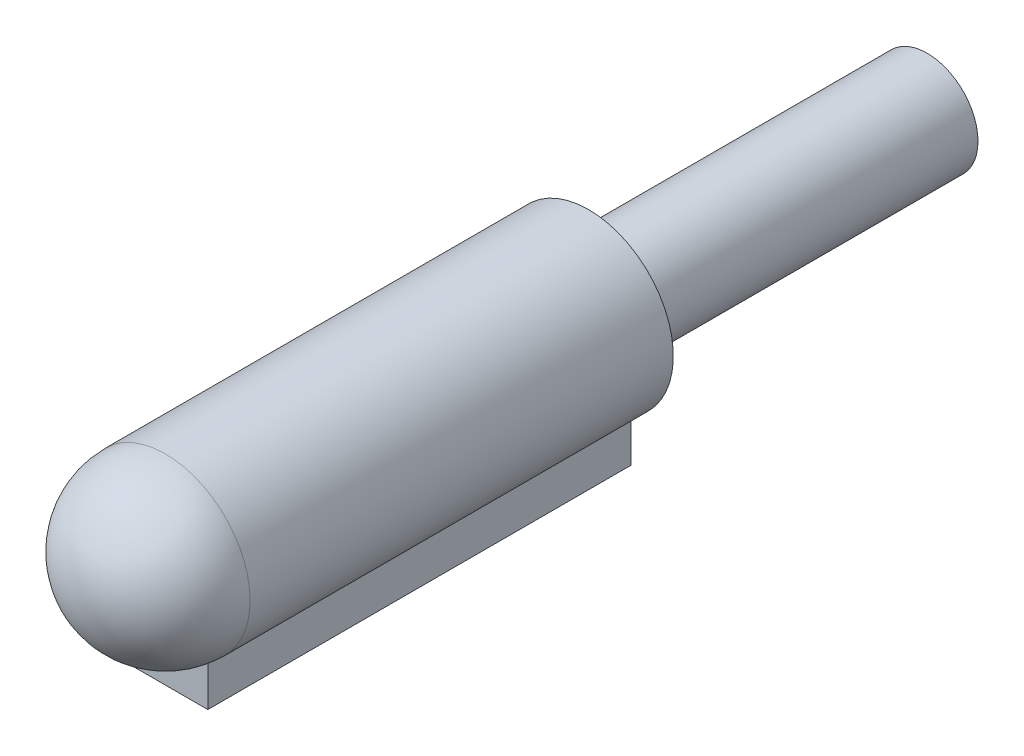
ISO-10303-21;
HEADER;
FILE_DESCRIPTION(('STEP AP214'),'2;1');
FILE_NAME('part.step','',(''),(''),'','','');
FILE_SCHEMA(('AUTOMOTIVE_DESIGN { 1 0 10303 214 1 1 1 1 }'));
ENDSEC;
DATA;
#1=APPLICATION_CONTEXT('core data for automotive mechanical design processes');
#2=APPLICATION_PROTOCOL_DEFINITION('international standard','automotive_design',2000,#1);
#3=PRODUCT_CONTEXT('',#1,'mechanical');
#4=PRODUCT('Part','Part','',(#3));
#5=PRODUCT_RELATED_PRODUCT_CATEGORY('part','',(#4));
#6=PRODUCT_DEFINITION_FORMATION('','',#4);
#7=PRODUCT_DEFINITION_CONTEXT('part definition',#1,'design');
#8=PRODUCT_DEFINITION('design','',#6,#7);
#9=PRODUCT_DEFINITION_SHAPE('','',#8);
#10=(LENGTH_UNIT() NAMED_UNIT(*) SI_UNIT(.MILLI.,.METRE.));
#11=(NAMED_UNIT(*) PLANE_ANGLE_UNIT() SI_UNIT($,.RADIAN.));
#12=(NAMED_UNIT(*) SI_UNIT($,.STERADIAN.) SOLID_ANGLE_UNIT());
#13=UNCERTAINTY_MEASURE_WITH_UNIT(LENGTH_MEASURE(1.E-05),#10,'distance_accuracy_value','');
#14=(GEOMETRIC_REPRESENTATION_CONTEXT(3) GLOBAL_UNCERTAINTY_ASSIGNED_CONTEXT((#13)) GLOBAL_UNIT_ASSIGNED_CONTEXT((#10,
#11,#12)) REPRESENTATION_CONTEXT('',''));
#15=CARTESIAN_POINT('',(0.,0.,0.));
#16=DIRECTION('',(0.,0.,1.));
#17=DIRECTION('',(1.,0.,0.));
#18=AXIS2_PLACEMENT_3D('',#15,#16,#17);
#19=CARTESIAN_POINT('',(0.,0.,30.));
#20=DIRECTION('',(0.,0.,-1.));
#21=DIRECTION('',(-1.,0.,0.));
#22=AXIS2_PLACEMENT_3D('',#19,#20,#21);
#23=CYLINDRICAL_SURFACE('',#22,5.);
#24=DIRECTION('',(0.,0.,-1.));
#25=VECTOR('',#24,1.);
#26=CARTESIAN_POINT('',(2.5,-4.33012701892219,25.));
#27=LINE('',#26,#25);
#28=CARTESIAN_POINT('',(2.5,-4.33012701892219,25.));
#29=VERTEX_POINT('',#28);
#30=CARTESIAN_POINT('',(2.5,-4.33012701892219,0.));
#31=VERTEX_POINT('',#30);
#32=EDGE_CURVE('E59',#29,#31,#27,.T.);
#33=ORIENTED_EDGE('',*,*,#32,.T.);
#34=CARTESIAN_POINT('',(0.,0.,0.));
#35=DIRECTION('',(0.,0.,1.));
#36=DIRECTION('',(1.,0.,0.));
#37=AXIS2_PLACEMENT_3D('',#34,#35,#36);
#38=CIRCLE('',#37,5.);
#39=CARTESIAN_POINT('',(-2.5,-4.33012701892219,0.));
#40=VERTEX_POINT('',#39);
#41=EDGE_CURVE('E63',#31,#40,#38,.T.);
#42=ORIENTED_EDGE('',*,*,#41,.T.);
#43=DIRECTION('',(0.,0.,-1.));
#44=VECTOR('',#43,1.);
#45=CARTESIAN_POINT('',(-2.5,-4.33012701892219,25.));
#46=LINE('',#45,#44);
#47=CARTESIAN_POINT('',(-2.5,-4.33012701892219,25.));
#48=VERTEX_POINT('',#47);
#49=EDGE_CURVE('E116',#48,#40,#46,.T.);
#50=ORIENTED_EDGE('',*,*,#49,.F.);
#51=CARTESIAN_POINT('',(0.,0.,25.));
#52=DIRECTION('',(0.,0.,-1.));
#53=DIRECTION('',(-1.,0.,0.));
#54=AXIS2_PLACEMENT_3D('',#51,#52,#53);
#55=CIRCLE('',#54,5.);
#56=EDGE_CURVE('E52',#48,#29,#55,.T.);
#57=ORIENTED_EDGE('',*,*,#56,.T.);
#58=EDGE_LOOP('',(#33,#42,#50,#57));
#59=FACE_BOUND('',#58,.T.);
#60=ADVANCED_FACE('F44',(#59),#23,.T.);
#61=CARTESIAN_POINT('',(0.,0.,0.));
#62=DIRECTION('',(0.,0.,1.));
#63=DIRECTION('',(1.,0.,0.));
#64=AXIS2_PLACEMENT_3D('',#61,#62,#63);
#65=PLANE('',#64);
#66=CARTESIAN_POINT('',(0.,0.,0.));
#67=DIRECTION('',(0.,0.,1.));
#68=DIRECTION('',(1.,0.,0.));
#69=AXIS2_PLACEMENT_3D('',#66,#67,#68);
#70=CIRCLE('',#69,3.);
#71=CARTESIAN_POINT('',(3.,0.,0.));
#72=VERTEX_POINT('',#71);
#73=EDGE_CURVE('E115',#72,#72,#70,.T.);
#74=ORIENTED_EDGE('',*,*,#73,.T.);
#75=EDGE_LOOP('',(#74));
#76=FACE_BOUND('',#75,.T.);
#77=ORIENTED_EDGE('',*,*,#41,.F.);
#78=DIRECTION('',(0.,1.,0.));
#79=VECTOR('',#78,1.);
#80=CARTESIAN_POINT('',(2.5,0.,0.));
#81=LINE('',#80,#79);
#82=CARTESIAN_POINT('',(2.5,-6.83012701892219,0.));
#83=VERTEX_POINT('',#82);
#84=EDGE_CURVE('E111',#83,#31,#81,.T.);
#85=ORIENTED_EDGE('',*,*,#84,.F.);
#86=DIRECTION('',(1.,0.,0.));
#87=VECTOR('',#86,1.);
#88=CARTESIAN_POINT('',(0.,-6.83012701892219,0.));
#89=LINE('',#88,#87);
#90=CARTESIAN_POINT('',(-2.5,-6.83012701892219,0.));
#91=VERTEX_POINT('',#90);
#92=EDGE_CURVE('E99',#91,#83,#89,.T.);
#93=ORIENTED_EDGE('',*,*,#92,.F.);
#94=DIRECTION('',(0.,-1.,0.));
#95=VECTOR('',#94,1.);
#96=CARTESIAN_POINT('',(-2.5,0.,0.));
#97=LINE('',#96,#95);
#98=EDGE_CURVE('E106',#40,#91,#97,.T.);
#99=ORIENTED_EDGE('',*,*,#98,.F.);
#100=EDGE_LOOP('',(#77,#85,#93,#99));
#101=FACE_BOUND('',#100,.T.);
#102=ADVANCED_FACE('F129',(#76,#101),#65,.F.);
#103=CARTESIAN_POINT('',(0.,0.,-20.));
#104=DIRECTION('',(0.,0.,1.));
#105=DIRECTION('',(1.,0.,0.));
#106=AXIS2_PLACEMENT_3D('',#103,#104,#105);
#107=CYLINDRICAL_SURFACE('',#106,3.);
#108=CARTESIAN_POINT('',(0.,0.,-20.));
#109=DIRECTION('',(0.,0.,1.));
#110=DIRECTION('',(1.,0.,0.));
#111=AXIS2_PLACEMENT_3D('',#108,#109,#110);
#112=CIRCLE('',#111,3.);
#113=CARTESIAN_POINT('',(3.,0.,-20.));
#114=VERTEX_POINT('',#113);
#115=EDGE_CURVE('E119',#114,#114,#112,.T.);
#116=ORIENTED_EDGE('',*,*,#115,.T.);
#117=EDGE_LOOP('',(#116));
#118=FACE_BOUND('',#117,.T.);
#119=ORIENTED_EDGE('',*,*,#73,.F.);
#120=EDGE_LOOP('',(#119));
#121=FACE_BOUND('',#120,.T.);
#122=ADVANCED_FACE('F131',(#118,#121),#107,.T.);
#123=CARTESIAN_POINT('',(0.,0.,-20.));
#124=DIRECTION('',(0.,0.,1.));
#125=DIRECTION('',(1.,0.,0.));
#126=AXIS2_PLACEMENT_3D('',#123,#124,#125);
#127=PLANE('',#126);
#128=ORIENTED_EDGE('',*,*,#115,.F.);
#129=EDGE_LOOP('',(#128));
#130=FACE_BOUND('',#129,.T.);
#131=ADVANCED_FACE('F138',(#130),#127,.F.);
#132=CARTESIAN_POINT('',(0.,0.,25.));
#133=DIRECTION('',(0.,0.,1.));
#134=DIRECTION('',(1.,0.,0.));
#135=AXIS2_PLACEMENT_3D('',#132,#133,#134);
#136=SPHERICAL_SURFACE('',#135,5.);
#137=EDGE_CURVE('E13',#29,#48,#55,.T.);
#138=ORIENTED_EDGE('',*,*,#137,.F.);
#139=ORIENTED_EDGE('',*,*,#56,.F.);
#140=EDGE_LOOP('',(#138,#139));
#141=FACE_BOUND('',#140,.T.);
#142=ADVANCED_FACE('F46',(#141),#136,.T.);
#143=CARTESIAN_POINT('',(2.5,0.,25.));
#144=DIRECTION('',(-1.,0.,0.));
#145=DIRECTION('',(0.,0.,1.));
#146=AXIS2_PLACEMENT_3D('',#143,#144,#145);
#147=PLANE('',#146);
#148=ORIENTED_EDGE('',*,*,#84,.T.);
#149=ORIENTED_EDGE('',*,*,#32,.F.);
#150=DIRECTION('',(0.,1.,0.));
#151=VECTOR('',#150,1.);
#152=CARTESIAN_POINT('',(2.5,0.,25.));
#153=LINE('',#152,#151);
#154=CARTESIAN_POINT('',(2.5,-6.83012701892219,25.));
#155=VERTEX_POINT('',#154);
#156=EDGE_CURVE('E88',#155,#29,#153,.T.);
#157=ORIENTED_EDGE('',*,*,#156,.F.);
#158=DIRECTION('',(0.,0.,-1.));
#159=VECTOR('',#158,1.);
#160=CARTESIAN_POINT('',(2.5,-6.83012701892219,25.));
#161=LINE('',#160,#159);
#162=EDGE_CURVE('E96',#155,#83,#161,.T.);
#163=ORIENTED_EDGE('',*,*,#162,.T.);
#164=EDGE_LOOP('',(#148,#149,#157,#163));
#165=FACE_BOUND('',#164,.T.);
#166=ADVANCED_FACE('F105',(#165),#147,.F.);
#167=CARTESIAN_POINT('',(-2.5,0.,25.));
#168=DIRECTION('',(1.,0.,0.));
#169=DIRECTION('',(0.,0.,-1.));
#170=AXIS2_PLACEMENT_3D('',#167,#168,#169);
#171=PLANE('',#170);
#172=ORIENTED_EDGE('',*,*,#98,.T.);
#173=DIRECTION('',(0.,0.,-1.));
#174=VECTOR('',#173,1.);
#175=CARTESIAN_POINT('',(-2.5,-6.83012701892219,25.));
#176=LINE('',#175,#174);
#177=CARTESIAN_POINT('',(-2.5,-6.83012701892219,25.));
#178=VERTEX_POINT('',#177);
#179=EDGE_CURVE('E103',#178,#91,#176,.T.);
#180=ORIENTED_EDGE('',*,*,#179,.F.);
#181=DIRECTION('',(0.,-1.,0.));
#182=VECTOR('',#181,1.);
#183=CARTESIAN_POINT('',(-2.5,0.,25.));
#184=LINE('',#183,#182);
#185=EDGE_CURVE('E90',#48,#178,#184,.T.);
#186=ORIENTED_EDGE('',*,*,#185,.F.);
#187=ORIENTED_EDGE('',*,*,#49,.T.);
#188=EDGE_LOOP('',(#172,#180,#186,#187));
#189=FACE_BOUND('',#188,.T.);
#190=ADVANCED_FACE('F126',(#189),#171,.F.);
#191=CARTESIAN_POINT('',(0.,-6.83012701892219,25.));
#192=DIRECTION('',(0.,1.,0.));
#193=DIRECTION('',(0.,0.,1.));
#194=AXIS2_PLACEMENT_3D('',#191,#192,#193);
#195=PLANE('',#194);
#196=ORIENTED_EDGE('',*,*,#92,.T.);
#197=ORIENTED_EDGE('',*,*,#162,.F.);
#198=DIRECTION('',(1.,0.,0.));
#199=VECTOR('',#198,1.);
#200=CARTESIAN_POINT('',(0.,-6.83012701892219,25.));
#201=LINE('',#200,#199);
#202=EDGE_CURVE('E84',#178,#155,#201,.T.);
#203=ORIENTED_EDGE('',*,*,#202,.F.);
#204=ORIENTED_EDGE('',*,*,#179,.T.);
#205=EDGE_LOOP('',(#196,#197,#203,#204));
#206=FACE_BOUND('',#205,.T.);
#207=ADVANCED_FACE('F97',(#206),#195,.F.);
#208=CARTESIAN_POINT('',(0.,0.,25.));
#209=DIRECTION('',(0.,0.,-1.));
#210=DIRECTION('',(-1.,0.,0.));
#211=AXIS2_PLACEMENT_3D('',#208,#209,#210);
#212=PLANE('',#211);
#213=ORIENTED_EDGE('',*,*,#156,.T.);
#214=ORIENTED_EDGE('',*,*,#137,.T.);
#215=ORIENTED_EDGE('',*,*,#185,.T.);
#216=ORIENTED_EDGE('',*,*,#202,.T.);
#217=EDGE_LOOP('',(#213,#214,#215,#216));
#218=FACE_BOUND('',#217,.T.);
#219=ADVANCED_FACE('F86',(#218),#212,.F.);
#220=CLOSED_SHELL('',(#60,#102,#122,#131,#142,#166,#190,#207,#219));
#221=MANIFOLD_SOLID_BREP('B2',#220);
#222=ADVANCED_BREP_SHAPE_REPRESENTATION('',(#18,#221),#14);
#223=SHAPE_DEFINITION_REPRESENTATION(#9,#222);
ENDSEC;
END-ISO-10303-21;
